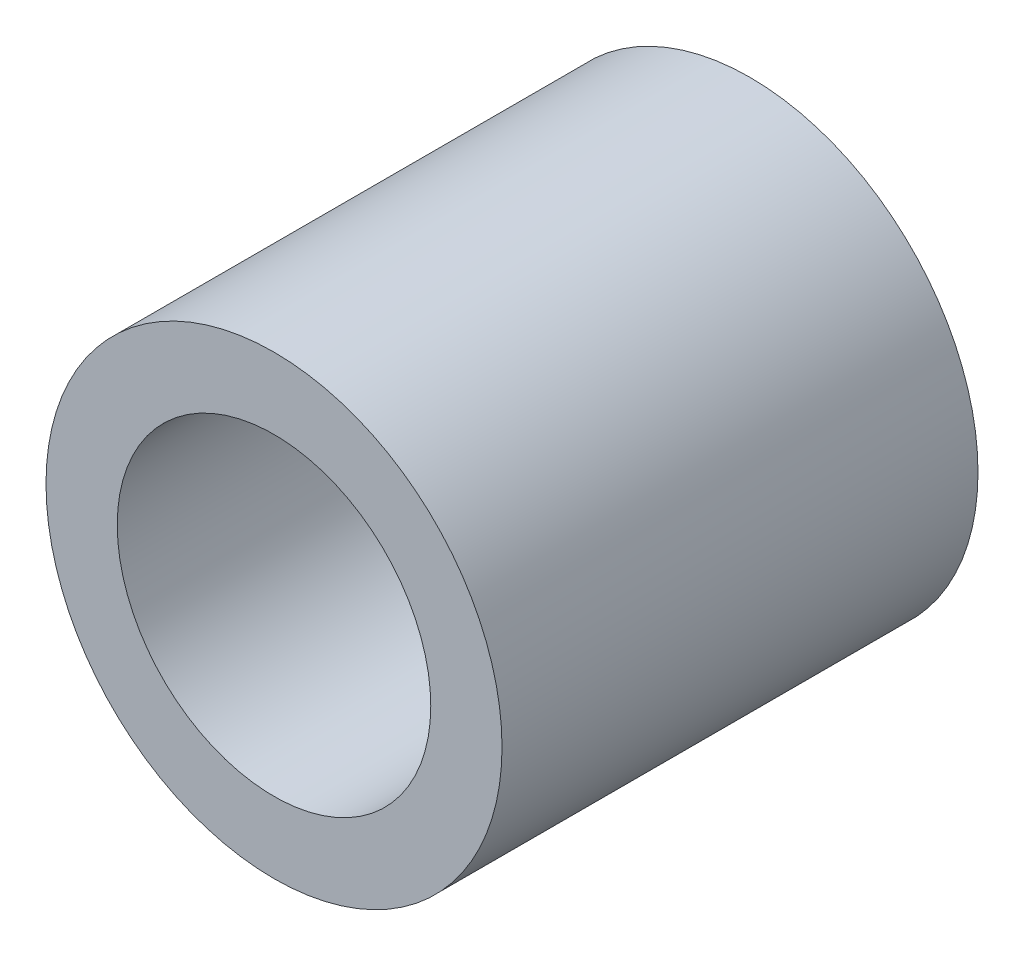
ISO-10303-21;
HEADER;
FILE_DESCRIPTION(('STEP AP214'),'2;1');
FILE_NAME('part.step','',(''),(''),'','','');
FILE_SCHEMA(('AUTOMOTIVE_DESIGN { 1 0 10303 214 1 1 1 1 }'));
ENDSEC;
DATA;
#1=APPLICATION_CONTEXT('core data for automotive mechanical design processes');
#2=APPLICATION_PROTOCOL_DEFINITION('international standard','automotive_design',2000,#1);
#3=PRODUCT_CONTEXT('',#1,'mechanical');
#4=PRODUCT('Part','Part','',(#3));
#5=PRODUCT_RELATED_PRODUCT_CATEGORY('part','',(#4));
#6=PRODUCT_DEFINITION_FORMATION('','',#4);
#7=PRODUCT_DEFINITION_CONTEXT('part definition',#1,'design');
#8=PRODUCT_DEFINITION('design','',#6,#7);
#9=PRODUCT_DEFINITION_SHAPE('','',#8);
#10=(LENGTH_UNIT() NAMED_UNIT(*) SI_UNIT(.MILLI.,.METRE.));
#11=(NAMED_UNIT(*) PLANE_ANGLE_UNIT() SI_UNIT($,.RADIAN.));
#12=(NAMED_UNIT(*) SI_UNIT($,.STERADIAN.) SOLID_ANGLE_UNIT());
#13=UNCERTAINTY_MEASURE_WITH_UNIT(LENGTH_MEASURE(1.E-05),#10,'distance_accuracy_value','');
#14=(GEOMETRIC_REPRESENTATION_CONTEXT(3) GLOBAL_UNCERTAINTY_ASSIGNED_CONTEXT((#13)) GLOBAL_UNIT_ASSIGNED_CONTEXT((#10,
#11,#12)) REPRESENTATION_CONTEXT('',''));
#15=CARTESIAN_POINT('',(0.,0.,0.));
#16=DIRECTION('',(0.,0.,1.));
#17=DIRECTION('',(1.,0.,0.));
#18=AXIS2_PLACEMENT_3D('',#15,#16,#17);
#19=CARTESIAN_POINT('',(0.,0.,8.35));
#20=DIRECTION('',(0.,0.,1.));
#21=DIRECTION('',(1.,0.,0.));
#22=AXIS2_PLACEMENT_3D('',#19,#20,#21);
#23=PLANE('',#22);
#24=CARTESIAN_POINT('',(0.,0.,8.35));
#25=DIRECTION('',(0.,0.,1.));
#26=DIRECTION('',(1.,0.,0.));
#27=AXIS2_PLACEMENT_3D('',#24,#25,#26);
#28=CIRCLE('',#27,4.);
#29=CARTESIAN_POINT('',(4.,0.,8.35));
#30=VERTEX_POINT('',#29);
#31=EDGE_CURVE('E10',#30,#30,#28,.T.);
#32=ORIENTED_EDGE('',*,*,#31,.T.);
#33=EDGE_LOOP('',(#32));
#34=FACE_BOUND('',#33,.T.);
#35=CARTESIAN_POINT('',(0.,0.,8.35));
#36=DIRECTION('',(0.,0.,1.));
#37=DIRECTION('',(1.,0.,0.));
#38=AXIS2_PLACEMENT_3D('',#35,#36,#37);
#39=CIRCLE('',#38,2.75);
#40=CARTESIAN_POINT('',(2.75,0.,8.35));
#41=VERTEX_POINT('',#40);
#42=EDGE_CURVE('E45',#41,#41,#39,.T.);
#43=ORIENTED_EDGE('',*,*,#42,.F.);
#44=EDGE_LOOP('',(#43));
#45=FACE_BOUND('',#44,.T.);
#46=ADVANCED_FACE('F34',(#34,#45),#23,.T.);
#47=CARTESIAN_POINT('',(0.,0.,0.));
#48=DIRECTION('',(0.,0.,1.));
#49=DIRECTION('',(1.,0.,0.));
#50=AXIS2_PLACEMENT_3D('',#47,#48,#49);
#51=PLANE('',#50);
#52=CARTESIAN_POINT('',(0.,0.,0.));
#53=DIRECTION('',(0.,0.,1.));
#54=DIRECTION('',(1.,0.,0.));
#55=AXIS2_PLACEMENT_3D('',#52,#53,#54);
#56=CIRCLE('',#55,4.);
#57=CARTESIAN_POINT('',(4.,0.,0.));
#58=VERTEX_POINT('',#57);
#59=EDGE_CURVE('E38',#58,#58,#56,.T.);
#60=ORIENTED_EDGE('',*,*,#59,.F.);
#61=EDGE_LOOP('',(#60));
#62=FACE_BOUND('',#61,.T.);
#63=CARTESIAN_POINT('',(0.,0.,0.));
#64=DIRECTION('',(0.,0.,1.));
#65=DIRECTION('',(1.,0.,0.));
#66=AXIS2_PLACEMENT_3D('',#63,#64,#65);
#67=CIRCLE('',#66,2.75);
#68=CARTESIAN_POINT('',(2.75,0.,0.));
#69=VERTEX_POINT('',#68);
#70=EDGE_CURVE('E47',#69,#69,#67,.T.);
#71=ORIENTED_EDGE('',*,*,#70,.T.);
#72=EDGE_LOOP('',(#71));
#73=FACE_BOUND('',#72,.T.);
#74=ADVANCED_FACE('F57',(#62,#73),#51,.F.);
#75=CARTESIAN_POINT('',(0.,0.,8.35));
#76=DIRECTION('',(0.,0.,-1.));
#77=DIRECTION('',(-1.,0.,0.));
#78=AXIS2_PLACEMENT_3D('',#75,#76,#77);
#79=CYLINDRICAL_SURFACE('',#78,4.);
#80=ORIENTED_EDGE('',*,*,#31,.F.);
#81=EDGE_LOOP('',(#80));
#82=FACE_BOUND('',#81,.T.);
#83=ORIENTED_EDGE('',*,*,#59,.T.);
#84=EDGE_LOOP('',(#83));
#85=FACE_BOUND('',#84,.T.);
#86=ADVANCED_FACE('F36',(#82,#85),#79,.T.);
#87=CARTESIAN_POINT('',(0.,0.,8.35));
#88=DIRECTION('',(0.,0.,-1.));
#89=DIRECTION('',(-1.,0.,0.));
#90=AXIS2_PLACEMENT_3D('',#87,#88,#89);
#91=CYLINDRICAL_SURFACE('',#90,2.75);
#92=ORIENTED_EDGE('',*,*,#42,.T.);
#93=EDGE_LOOP('',(#92));
#94=FACE_BOUND('',#93,.T.);
#95=ORIENTED_EDGE('',*,*,#70,.F.);
#96=EDGE_LOOP('',(#95));
#97=FACE_BOUND('',#96,.T.);
#98=ADVANCED_FACE('F53',(#94,#97),#91,.F.);
#99=CLOSED_SHELL('',(#46,#74,#86,#98));
#100=MANIFOLD_SOLID_BREP('B2',#99);
#101=ADVANCED_BREP_SHAPE_REPRESENTATION('',(#18,#100),#14);
#102=SHAPE_DEFINITION_REPRESENTATION(#9,#101);
ENDSEC;
END-ISO-10303-21;
